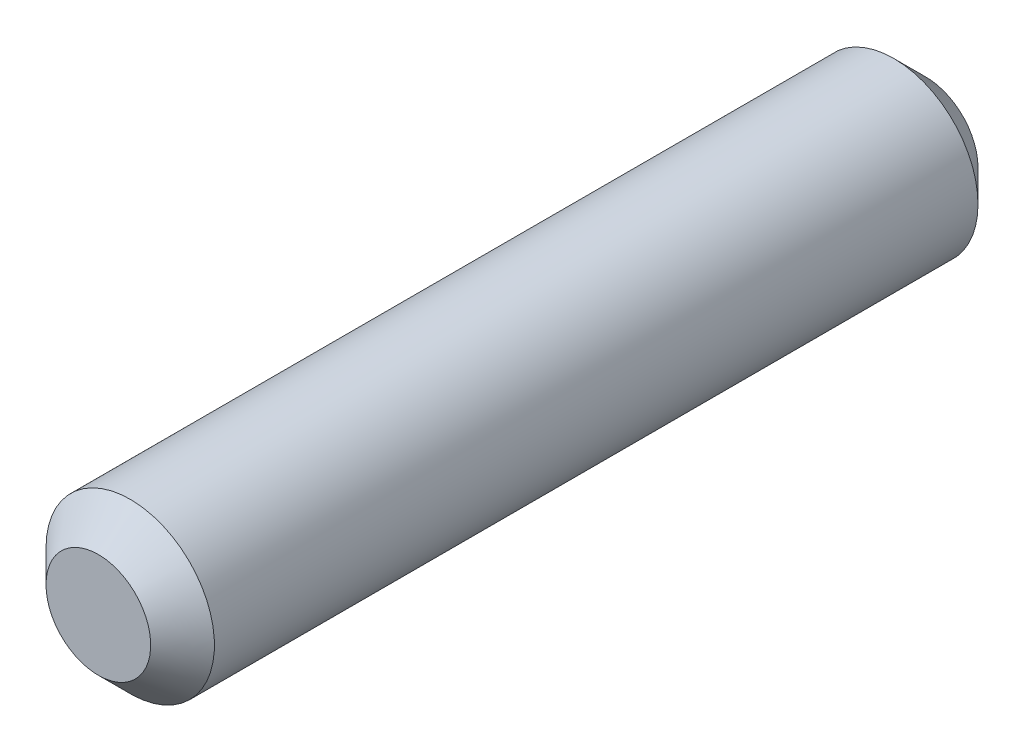
ISO-10303-21;
HEADER;
FILE_DESCRIPTION(('STEP AP214'),'2;1');
FILE_NAME('part.step','',(''),(''),'','','');
FILE_SCHEMA(('AUTOMOTIVE_DESIGN { 1 0 10303 214 1 1 1 1 }'));
ENDSEC;
DATA;
#1=APPLICATION_CONTEXT('core data for automotive mechanical design processes');
#2=APPLICATION_PROTOCOL_DEFINITION('international standard','automotive_design',2000,#1);
#3=PRODUCT_CONTEXT('',#1,'mechanical');
#4=PRODUCT('Part','Part','',(#3));
#5=PRODUCT_RELATED_PRODUCT_CATEGORY('part','',(#4));
#6=PRODUCT_DEFINITION_FORMATION('','',#4);
#7=PRODUCT_DEFINITION_CONTEXT('part definition',#1,'design');
#8=PRODUCT_DEFINITION('design','',#6,#7);
#9=PRODUCT_DEFINITION_SHAPE('','',#8);
#10=(LENGTH_UNIT() NAMED_UNIT(*) SI_UNIT(.MILLI.,.METRE.));
#11=(NAMED_UNIT(*) PLANE_ANGLE_UNIT() SI_UNIT($,.RADIAN.));
#12=(NAMED_UNIT(*) SI_UNIT($,.STERADIAN.) SOLID_ANGLE_UNIT());
#13=UNCERTAINTY_MEASURE_WITH_UNIT(LENGTH_MEASURE(1.E-05),#10,'distance_accuracy_value','');
#14=(GEOMETRIC_REPRESENTATION_CONTEXT(3) GLOBAL_UNCERTAINTY_ASSIGNED_CONTEXT((#13)) GLOBAL_UNIT_ASSIGNED_CONTEXT((#10,
#11,#12)) REPRESENTATION_CONTEXT('',''));
#15=CARTESIAN_POINT('',(0.,0.,0.));
#16=DIRECTION('',(0.,0.,1.));
#17=DIRECTION('',(1.,0.,0.));
#18=AXIS2_PLACEMENT_3D('',#15,#16,#17);
#19=CARTESIAN_POINT('',(0.,0.,7.785));
#20=DIRECTION('',(0.,0.,-1.));
#21=DIRECTION('',(-1.,0.,0.));
#22=AXIS2_PLACEMENT_3D('',#19,#20,#21);
#23=CYLINDRICAL_SURFACE('',#22,1.585);
#24=CARTESIAN_POINT('',(0.,0.,-7.185));
#25=DIRECTION('',(0.,0.,1.));
#26=DIRECTION('',(1.,0.,0.));
#27=AXIS2_PLACEMENT_3D('',#24,#25,#26);
#28=CIRCLE('',#27,1.585);
#29=CARTESIAN_POINT('',(1.585,0.,-7.185));
#30=VERTEX_POINT('',#29);
#31=EDGE_CURVE('E44',#30,#30,#28,.T.);
#32=ORIENTED_EDGE('',*,*,#31,.T.);
#33=EDGE_LOOP('',(#32));
#34=FACE_BOUND('',#33,.T.);
#35=CARTESIAN_POINT('',(0.,0.,7.18499999999999));
#36=DIRECTION('',(0.,0.,1.));
#37=DIRECTION('',(1.,0.,0.));
#38=AXIS2_PLACEMENT_3D('',#35,#36,#37);
#39=CIRCLE('',#38,1.585);
#40=CARTESIAN_POINT('',(-1.585,0.,7.18499999999999));
#41=VERTEX_POINT('',#40);
#42=EDGE_CURVE('E48',#41,#41,#39,.F.);
#43=ORIENTED_EDGE('',*,*,#42,.T.);
#44=EDGE_LOOP('',(#43));
#45=FACE_BOUND('',#44,.T.);
#46=ADVANCED_FACE('F32',(#34,#45),#23,.T.);
#47=CARTESIAN_POINT('',(0.,0.,7.785));
#48=DIRECTION('',(0.,0.,1.));
#49=DIRECTION('',(1.,0.,0.));
#50=AXIS2_PLACEMENT_3D('',#47,#48,#49);
#51=PLANE('',#50);
#52=CARTESIAN_POINT('',(0.,0.,7.785));
#53=DIRECTION('',(0.,0.,1.));
#54=DIRECTION('',(1.,0.,0.));
#55=AXIS2_PLACEMENT_3D('',#52,#53,#54);
#56=CIRCLE('',#55,0.984999999999997);
#57=CARTESIAN_POINT('',(-0.984999999999997,0.,7.785));
#58=VERTEX_POINT('',#57);
#59=EDGE_CURVE('E10',#58,#58,#56,.T.);
#60=ORIENTED_EDGE('',*,*,#59,.T.);
#61=EDGE_LOOP('',(#60));
#62=FACE_BOUND('',#61,.T.);
#63=ADVANCED_FACE('F64',(#62),#51,.T.);
#64=CARTESIAN_POINT('',(0.,0.,-7.785));
#65=DIRECTION('',(0.,0.,1.));
#66=DIRECTION('',(1.,0.,0.));
#67=AXIS2_PLACEMENT_3D('',#64,#65,#66);
#68=PLANE('',#67);
#69=CARTESIAN_POINT('',(0.,0.,-7.785));
#70=DIRECTION('',(0.,0.,1.));
#71=DIRECTION('',(1.,0.,0.));
#72=AXIS2_PLACEMENT_3D('',#69,#70,#71);
#73=CIRCLE('',#72,0.984999999999998);
#74=CARTESIAN_POINT('',(0.984999999999998,0.,-7.785));
#75=VERTEX_POINT('',#74);
#76=EDGE_CURVE('E40',#75,#75,#73,.F.);
#77=ORIENTED_EDGE('',*,*,#76,.T.);
#78=EDGE_LOOP('',(#77));
#79=FACE_BOUND('',#78,.T.);
#80=ADVANCED_FACE('F61',(#79),#68,.F.);
#81=CARTESIAN_POINT('',(0.,0.,-7.185));
#82=DIRECTION('',(0.,0.,1.));
#83=DIRECTION('',(1.,0.,0.));
#84=AXIS2_PLACEMENT_3D('',#81,#82,#83);
#85=CONICAL_SURFACE('',#84,1.585,0.78539816339745);
#86=ORIENTED_EDGE('',*,*,#76,.F.);
#87=EDGE_LOOP('',(#86));
#88=FACE_BOUND('',#87,.T.);
#89=ORIENTED_EDGE('',*,*,#31,.F.);
#90=EDGE_LOOP('',(#89));
#91=FACE_BOUND('',#90,.T.);
#92=ADVANCED_FACE('F57',(#88,#91),#85,.T.);
#93=CARTESIAN_POINT('',(0.,0.,7.785));
#94=DIRECTION('',(0.,0.,-1.));
#95=DIRECTION('',(-1.,0.,0.));
#96=AXIS2_PLACEMENT_3D('',#93,#94,#95);
#97=CONICAL_SURFACE('',#96,0.984999999999997,0.785398163397446);
#98=CARTESIAN_POINT('',(-1.585,0.,7.18499999999999));
#99=CARTESIAN_POINT('',(-1.57875,0.,7.19124999999999));
#100=CARTESIAN_POINT('',(-1.5725,0.,7.19749999999999));
#101=CARTESIAN_POINT('',(-1.56,0.,7.20999999999999));
#102=CARTESIAN_POINT('',(-1.55375,0.,7.21624999999999));
#103=CARTESIAN_POINT('',(-1.54125,0.,7.22874999999999));
#104=CARTESIAN_POINT('',(-1.535,0.,7.23499999999999));
#105=CARTESIAN_POINT('',(-1.5225,0.,7.24749999999999));
#106=CARTESIAN_POINT('',(-1.51625,0.,7.25374999999999));
#107=CARTESIAN_POINT('',(-1.50375,0.,7.26624999999999));
#108=CARTESIAN_POINT('',(-1.4975,0.,7.2725));
#109=CARTESIAN_POINT('',(-1.485,0.,7.285));
#110=CARTESIAN_POINT('',(-1.47875,0.,7.29124999999999));
#111=CARTESIAN_POINT('',(-1.46625,0.,7.30375));
#112=CARTESIAN_POINT('',(-1.46,0.,7.31));
#113=CARTESIAN_POINT('',(-1.4475,0.,7.3225));
#114=CARTESIAN_POINT('',(-1.44125,0.,7.32874999999999));
#115=CARTESIAN_POINT('',(-1.42875,0.,7.34125));
#116=CARTESIAN_POINT('',(-1.4225,0.,7.3475));
#117=CARTESIAN_POINT('',(-1.41,0.,7.36));
#118=CARTESIAN_POINT('',(-1.40375,0.,7.36625));
#119=CARTESIAN_POINT('',(-1.39125,0.,7.37875));
#120=CARTESIAN_POINT('',(-1.385,0.,7.385));
#121=CARTESIAN_POINT('',(-1.3725,0.,7.3975));
#122=CARTESIAN_POINT('',(-1.36625,0.,7.40375));
#123=CARTESIAN_POINT('',(-1.35375,0.,7.41625));
#124=CARTESIAN_POINT('',(-1.3475,0.,7.4225));
#125=CARTESIAN_POINT('',(-1.335,0.,7.435));
#126=CARTESIAN_POINT('',(-1.32875,0.,7.44125));
#127=CARTESIAN_POINT('',(-1.31625,0.,7.45375));
#128=CARTESIAN_POINT('',(-1.31,0.,7.46));
#129=CARTESIAN_POINT('',(-1.2975,0.,7.4725));
#130=CARTESIAN_POINT('',(-1.29125,0.,7.47875));
#131=CARTESIAN_POINT('',(-1.27875,0.,7.49125));
#132=CARTESIAN_POINT('',(-1.2725,0.,7.4975));
#133=CARTESIAN_POINT('',(-1.26,0.,7.51));
#134=CARTESIAN_POINT('',(-1.25375,0.,7.51625));
#135=CARTESIAN_POINT('',(-1.24125,0.,7.52875));
#136=CARTESIAN_POINT('',(-1.235,0.,7.535));
#137=CARTESIAN_POINT('',(-1.2225,0.,7.5475));
#138=CARTESIAN_POINT('',(-1.21625,0.,7.55375));
#139=CARTESIAN_POINT('',(-1.20375,0.,7.56625));
#140=CARTESIAN_POINT('',(-1.1975,0.,7.5725));
#141=CARTESIAN_POINT('',(-1.185,0.,7.585));
#142=CARTESIAN_POINT('',(-1.17875,0.,7.59125));
#143=CARTESIAN_POINT('',(-1.16625,0.,7.60375));
#144=CARTESIAN_POINT('',(-1.16,0.,7.61));
#145=CARTESIAN_POINT('',(-1.1475,0.,7.6225));
#146=CARTESIAN_POINT('',(-1.14125,0.,7.62875));
#147=CARTESIAN_POINT('',(-1.12875,0.,7.64125));
#148=CARTESIAN_POINT('',(-1.1225,0.,7.6475));
#149=CARTESIAN_POINT('',(-1.11,0.,7.66));
#150=CARTESIAN_POINT('',(-1.10375,0.,7.66625));
#151=CARTESIAN_POINT('',(-1.09125,0.,7.67875));
#152=CARTESIAN_POINT('',(-1.085,0.,7.685));
#153=CARTESIAN_POINT('',(-1.0725,0.,7.6975));
#154=CARTESIAN_POINT('',(-1.06625,0.,7.70375));
#155=CARTESIAN_POINT('',(-1.05375,0.,7.71625));
#156=CARTESIAN_POINT('',(-1.0475,0.,7.7225));
#157=CARTESIAN_POINT('',(-1.035,0.,7.735));
#158=CARTESIAN_POINT('',(-1.02875,0.,7.74125));
#159=CARTESIAN_POINT('',(-1.01625,0.,7.75375));
#160=CARTESIAN_POINT('',(-1.01,0.,7.76));
#161=CARTESIAN_POINT('',(-0.997499999999997,0.,7.7725));
#162=CARTESIAN_POINT('',(-0.991249999999997,0.,7.77875));
#163=CARTESIAN_POINT('',(-0.984999999999997,0.,7.785));
#164=B_SPLINE_CURVE_WITH_KNOTS('',3,(#98,#99,#100,#101,#102,#103,#104,#105,#106,#107,#108,#109,
#110,#111,#112,#113,#114,#115,#116,#117,#118,#119,#120,#121,#122,#123,#124,#125,#126,#127,#128,
#129,#130,#131,#132,#133,#134,#135,#136,#137,#138,#139,#140,#141,#142,#143,#144,#145,#146,#147,
#148,#149,#150,#151,#152,#153,#154,#155,#156,#157,#158,#159,#160,#161,#162,#163),.UNSPECIFIED.,
.F.,.F.,(4,2,2,2,2,2,2,2,2,2,2,2,2,2,2,2,2,2,2,2,2,2,2,2,2,2,2,2,2,2,2,2,4),(0.,
0.0265165042944954,0.0530330085889914,0.0795495128834867,0.106066017177983,0.132582521472479,
0.159099025766974,0.18561553006147,0.212132034355965,0.238648538650461,0.265165042944957,
0.291681547239453,0.318198051533949,0.344714555828444,0.37123106012294,0.397747564417435,
0.424264068711931,0.450780573006427,0.477297077300923,0.503813581595419,0.530330085889914,
0.55684659018441,0.583363094478906,0.609879598773402,0.636396103067898,0.662912607362393,
0.689429111656889,0.715945615951385,0.74246212024588,0.768978624540376,0.795495128834872,
0.822011633129368,0.848528137423864),.UNSPECIFIED.);
#165=EDGE_CURVE('BSEAM35',#41,#58,#164,.T.);
#166=ORIENTED_EDGE('',*,*,#42,.F.);
#167=ORIENTED_EDGE('',*,*,#59,.F.);
#168=ORIENTED_EDGE('',*,*,#165,.T.);
#169=ORIENTED_EDGE('',*,*,#165,.F.);
#170=EDGE_LOOP('',(#166,#168,#167,#169));
#171=FACE_BOUND('',#170,.T.);
#172=ADVANCED_FACE('F35',(#171),#97,.T.);
#173=CLOSED_SHELL('',(#46,#63,#80,#92,#172));
#174=MANIFOLD_SOLID_BREP('B2',#173);
#175=ADVANCED_BREP_SHAPE_REPRESENTATION('',(#18,#174),#14);
#176=SHAPE_DEFINITION_REPRESENTATION(#9,#175);
ENDSEC;
END-ISO-10303-21;
